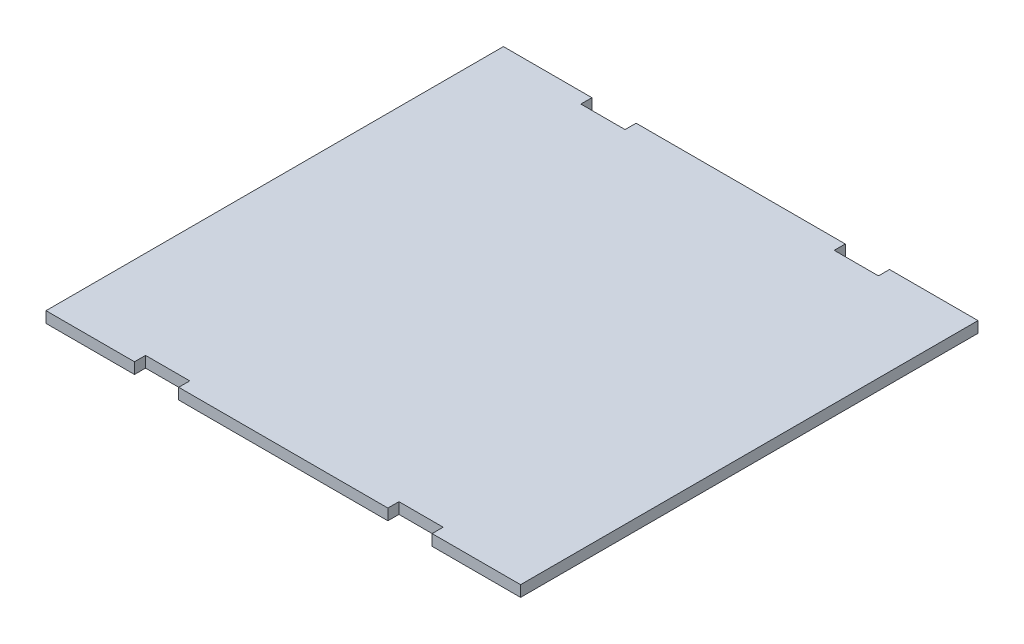
ISO-10303-21;
HEADER;
FILE_DESCRIPTION(('STEP AP214'),'2;1');
FILE_NAME('part.step','',(''),(''),'','','');
FILE_SCHEMA(('AUTOMOTIVE_DESIGN { 1 0 10303 214 1 1 1 1 }'));
ENDSEC;
DATA;
#1=APPLICATION_CONTEXT('core data for automotive mechanical design processes');
#2=APPLICATION_PROTOCOL_DEFINITION('international standard','automotive_design',2000,#1);
#3=PRODUCT_CONTEXT('',#1,'mechanical');
#4=PRODUCT('Part','Part','',(#3));
#5=PRODUCT_RELATED_PRODUCT_CATEGORY('part','',(#4));
#6=PRODUCT_DEFINITION_FORMATION('','',#4);
#7=PRODUCT_DEFINITION_CONTEXT('part definition',#1,'design');
#8=PRODUCT_DEFINITION('design','',#6,#7);
#9=PRODUCT_DEFINITION_SHAPE('','',#8);
#10=(LENGTH_UNIT() NAMED_UNIT(*) SI_UNIT(.MILLI.,.METRE.));
#11=(NAMED_UNIT(*) PLANE_ANGLE_UNIT() SI_UNIT($,.RADIAN.));
#12=(NAMED_UNIT(*) SI_UNIT($,.STERADIAN.) SOLID_ANGLE_UNIT());
#13=UNCERTAINTY_MEASURE_WITH_UNIT(LENGTH_MEASURE(1.E-05),#10,'distance_accuracy_value','');
#14=(GEOMETRIC_REPRESENTATION_CONTEXT(3) GLOBAL_UNCERTAINTY_ASSIGNED_CONTEXT((#13)) GLOBAL_UNIT_ASSIGNED_CONTEXT((#10,
#11,#12)) REPRESENTATION_CONTEXT('',''));
#15=CARTESIAN_POINT('',(0.,0.,0.));
#16=DIRECTION('',(0.,0.,1.));
#17=DIRECTION('',(1.,0.,0.));
#18=AXIS2_PLACEMENT_3D('',#15,#16,#17);
#19=CARTESIAN_POINT('',(-68.1228,3.175,-65.659));
#20=DIRECTION('',(1.,0.,0.));
#21=DIRECTION('',(0.,0.,-1.));
#22=AXIS2_PLACEMENT_3D('',#19,#20,#21);
#23=PLANE('',#22);
#24=DIRECTION('',(0.,0.,1.));
#25=VECTOR('',#24,1.);
#26=CARTESIAN_POINT('',(-68.1228,0.,-65.659));
#27=LINE('',#26,#25);
#28=CARTESIAN_POINT('',(-68.1228,0.,-65.659));
#29=VERTEX_POINT('',#28);
#30=CARTESIAN_POINT('',(-68.1228,0.,65.659));
#31=VERTEX_POINT('',#30);
#32=EDGE_CURVE('E201',#29,#31,#27,.T.);
#33=ORIENTED_EDGE('',*,*,#32,.T.);
#34=DIRECTION('',(0.,-1.,0.));
#35=VECTOR('',#34,1.);
#36=CARTESIAN_POINT('',(-68.1228,3.175,65.659));
#37=LINE('',#36,#35);
#38=CARTESIAN_POINT('',(-68.1228,3.175,65.659));
#39=VERTEX_POINT('',#38);
#40=EDGE_CURVE('E11',#39,#31,#37,.T.);
#41=ORIENTED_EDGE('',*,*,#40,.F.);
#42=DIRECTION('',(0.,0.,1.));
#43=VECTOR('',#42,1.);
#44=CARTESIAN_POINT('',(-68.1228,3.175,-65.659));
#45=LINE('',#44,#43);
#46=CARTESIAN_POINT('',(-68.1228,3.175,-65.659));
#47=VERTEX_POINT('',#46);
#48=EDGE_CURVE('E239',#47,#39,#45,.T.);
#49=ORIENTED_EDGE('',*,*,#48,.F.);
#50=DIRECTION('',(0.,-1.,0.));
#51=VECTOR('',#50,1.);
#52=CARTESIAN_POINT('',(-68.1228,3.175,-65.659));
#53=LINE('',#52,#51);
#54=EDGE_CURVE('E197',#47,#29,#53,.T.);
#55=ORIENTED_EDGE('',*,*,#54,.T.);
#56=EDGE_LOOP('',(#33,#41,#49,#55));
#57=FACE_BOUND('',#56,.T.);
#58=ADVANCED_FACE('F33',(#57),#23,.F.);
#59=CARTESIAN_POINT('',(-68.1228,3.175,65.659));
#60=DIRECTION('',(0.,0.,-1.));
#61=DIRECTION('',(-1.,0.,0.));
#62=AXIS2_PLACEMENT_3D('',#59,#60,#61);
#63=PLANE('',#62);
#64=DIRECTION('',(1.,0.,0.));
#65=VECTOR('',#64,1.);
#66=CARTESIAN_POINT('',(-68.1228,0.,65.659));
#67=LINE('',#66,#65);
#68=CARTESIAN_POINT('',(-42.7228,0.,65.659));
#69=VERTEX_POINT('',#68);
#70=EDGE_CURVE('E204',#31,#69,#67,.T.);
#71=ORIENTED_EDGE('',*,*,#70,.T.);
#72=DIRECTION('',(0.,-1.,0.));
#73=VECTOR('',#72,1.);
#74=CARTESIAN_POINT('',(-42.7228,3.175,65.659));
#75=LINE('',#74,#73);
#76=CARTESIAN_POINT('',(-42.7228,3.175,65.659));
#77=VERTEX_POINT('',#76);
#78=EDGE_CURVE('E41',#77,#69,#75,.T.);
#79=ORIENTED_EDGE('',*,*,#78,.F.);
#80=DIRECTION('',(1.,0.,0.));
#81=VECTOR('',#80,1.);
#82=CARTESIAN_POINT('',(-68.1228,3.175,65.659));
#83=LINE('',#82,#81);
#84=EDGE_CURVE('E128',#39,#77,#83,.T.);
#85=ORIENTED_EDGE('',*,*,#84,.F.);
#86=ORIENTED_EDGE('',*,*,#40,.T.);
#87=EDGE_LOOP('',(#71,#79,#85,#86));
#88=FACE_BOUND('',#87,.T.);
#89=ADVANCED_FACE('F357',(#88),#63,.F.);
#90=CARTESIAN_POINT('',(-42.7228,3.175,65.659));
#91=DIRECTION('',(-1.,0.,0.));
#92=DIRECTION('',(0.,0.,1.));
#93=AXIS2_PLACEMENT_3D('',#90,#91,#92);
#94=PLANE('',#93);
#95=DIRECTION('',(0.,0.,-1.));
#96=VECTOR('',#95,1.);
#97=CARTESIAN_POINT('',(-42.7228,0.,65.659));
#98=LINE('',#97,#96);
#99=CARTESIAN_POINT('',(-42.7228,0.,62.484));
#100=VERTEX_POINT('',#99);
#101=EDGE_CURVE('E206',#69,#100,#98,.T.);
#102=ORIENTED_EDGE('',*,*,#101,.T.);
#103=DIRECTION('',(0.,-1.,0.));
#104=VECTOR('',#103,1.);
#105=CARTESIAN_POINT('',(-42.7228,3.175,62.484));
#106=LINE('',#105,#104);
#107=CARTESIAN_POINT('',(-42.7228,3.175,62.484));
#108=VERTEX_POINT('',#107);
#109=EDGE_CURVE('E282',#108,#100,#106,.T.);
#110=ORIENTED_EDGE('',*,*,#109,.F.);
#111=DIRECTION('',(0.,0.,-1.));
#112=VECTOR('',#111,1.);
#113=CARTESIAN_POINT('',(-42.7228,3.175,65.659));
#114=LINE('',#113,#112);
#115=EDGE_CURVE('E290',#77,#108,#114,.T.);
#116=ORIENTED_EDGE('',*,*,#115,.F.);
#117=ORIENTED_EDGE('',*,*,#78,.T.);
#118=EDGE_LOOP('',(#102,#110,#116,#117));
#119=FACE_BOUND('',#118,.T.);
#120=ADVANCED_FACE('F288',(#119),#94,.F.);
#121=CARTESIAN_POINT('',(-42.7228,3.175,62.484));
#122=DIRECTION('',(0.,0.,-1.));
#123=DIRECTION('',(-1.,0.,0.));
#124=AXIS2_PLACEMENT_3D('',#121,#122,#123);
#125=PLANE('',#124);
#126=DIRECTION('',(1.,0.,0.));
#127=VECTOR('',#126,1.);
#128=CARTESIAN_POINT('',(-42.7228,0.,62.484));
#129=LINE('',#128,#127);
#130=CARTESIAN_POINT('',(-30.0228,0.,62.484));
#131=VERTEX_POINT('',#130);
#132=EDGE_CURVE('E208',#100,#131,#129,.T.);
#133=ORIENTED_EDGE('',*,*,#132,.T.);
#134=DIRECTION('',(0.,-1.,0.));
#135=VECTOR('',#134,1.);
#136=CARTESIAN_POINT('',(-30.0228,3.175,62.484));
#137=LINE('',#136,#135);
#138=CARTESIAN_POINT('',(-30.0228,3.175,62.484));
#139=VERTEX_POINT('',#138);
#140=EDGE_CURVE('E279',#139,#131,#137,.T.);
#141=ORIENTED_EDGE('',*,*,#140,.F.);
#142=DIRECTION('',(1.,0.,0.));
#143=VECTOR('',#142,1.);
#144=CARTESIAN_POINT('',(-42.7228,3.175,62.484));
#145=LINE('',#144,#143);
#146=EDGE_CURVE('E308',#108,#139,#145,.T.);
#147=ORIENTED_EDGE('',*,*,#146,.F.);
#148=ORIENTED_EDGE('',*,*,#109,.T.);
#149=EDGE_LOOP('',(#133,#141,#147,#148));
#150=FACE_BOUND('',#149,.T.);
#151=ADVANCED_FACE('F299',(#150),#125,.F.);
#152=CARTESIAN_POINT('',(-30.0228,3.175,62.484));
#153=DIRECTION('',(1.,0.,0.));
#154=DIRECTION('',(0.,0.,-1.));
#155=AXIS2_PLACEMENT_3D('',#152,#153,#154);
#156=PLANE('',#155);
#157=DIRECTION('',(0.,0.,1.));
#158=VECTOR('',#157,1.);
#159=CARTESIAN_POINT('',(-30.0228,0.,62.484));
#160=LINE('',#159,#158);
#161=CARTESIAN_POINT('',(-30.0228,0.,65.659));
#162=VERTEX_POINT('',#161);
#163=EDGE_CURVE('E210',#131,#162,#160,.T.);
#164=ORIENTED_EDGE('',*,*,#163,.T.);
#165=DIRECTION('',(0.,-1.,0.));
#166=VECTOR('',#165,1.);
#167=CARTESIAN_POINT('',(-30.0228,3.175,65.659));
#168=LINE('',#167,#166);
#169=CARTESIAN_POINT('',(-30.0228,3.175,65.659));
#170=VERTEX_POINT('',#169);
#171=EDGE_CURVE('E276',#170,#162,#168,.T.);
#172=ORIENTED_EDGE('',*,*,#171,.F.);
#173=DIRECTION('',(0.,0.,1.));
#174=VECTOR('',#173,1.);
#175=CARTESIAN_POINT('',(-30.0228,3.175,62.484));
#176=LINE('',#175,#174);
#177=EDGE_CURVE('E305',#139,#170,#176,.T.);
#178=ORIENTED_EDGE('',*,*,#177,.F.);
#179=ORIENTED_EDGE('',*,*,#140,.T.);
#180=EDGE_LOOP('',(#164,#172,#178,#179));
#181=FACE_BOUND('',#180,.T.);
#182=ADVANCED_FACE('F303',(#181),#156,.F.);
#183=CARTESIAN_POINT('',(-30.0228,3.175,65.659));
#184=DIRECTION('',(0.,0.,-1.));
#185=DIRECTION('',(-1.,0.,0.));
#186=AXIS2_PLACEMENT_3D('',#183,#184,#185);
#187=PLANE('',#186);
#188=DIRECTION('',(1.,0.,0.));
#189=VECTOR('',#188,1.);
#190=CARTESIAN_POINT('',(-30.0228,0.,65.659));
#191=LINE('',#190,#189);
#192=CARTESIAN_POINT('',(30.0228000000001,0.,65.659));
#193=VERTEX_POINT('',#192);
#194=EDGE_CURVE('E212',#162,#193,#191,.T.);
#195=ORIENTED_EDGE('',*,*,#194,.T.);
#196=DIRECTION('',(0.,-1.,0.));
#197=VECTOR('',#196,1.);
#198=CARTESIAN_POINT('',(30.0228000000001,3.175,65.659));
#199=LINE('',#198,#197);
#200=CARTESIAN_POINT('',(30.0228000000001,3.175,65.659));
#201=VERTEX_POINT('',#200);
#202=EDGE_CURVE('E273',#201,#193,#199,.T.);
#203=ORIENTED_EDGE('',*,*,#202,.F.);
#204=DIRECTION('',(1.,0.,0.));
#205=VECTOR('',#204,1.);
#206=CARTESIAN_POINT('',(-30.0228,3.175,65.659));
#207=LINE('',#206,#205);
#208=EDGE_CURVE('E307',#170,#201,#207,.T.);
#209=ORIENTED_EDGE('',*,*,#208,.F.);
#210=ORIENTED_EDGE('',*,*,#171,.T.);
#211=EDGE_LOOP('',(#195,#203,#209,#210));
#212=FACE_BOUND('',#211,.T.);
#213=ADVANCED_FACE('F370',(#212),#187,.F.);
#214=CARTESIAN_POINT('',(30.0228000000001,3.175,65.659));
#215=DIRECTION('',(-1.,0.,0.));
#216=DIRECTION('',(0.,0.,1.));
#217=AXIS2_PLACEMENT_3D('',#214,#215,#216);
#218=PLANE('',#217);
#219=DIRECTION('',(0.,0.,-1.));
#220=VECTOR('',#219,1.);
#221=CARTESIAN_POINT('',(30.0228000000001,0.,65.659));
#222=LINE('',#221,#220);
#223=CARTESIAN_POINT('',(30.0228000000001,0.,62.484));
#224=VERTEX_POINT('',#223);
#225=EDGE_CURVE('E214',#193,#224,#222,.T.);
#226=ORIENTED_EDGE('',*,*,#225,.T.);
#227=DIRECTION('',(0.,-1.,0.));
#228=VECTOR('',#227,1.);
#229=CARTESIAN_POINT('',(30.0228000000001,3.175,62.484));
#230=LINE('',#229,#228);
#231=CARTESIAN_POINT('',(30.0228000000001,3.175,62.484));
#232=VERTEX_POINT('',#231);
#233=EDGE_CURVE('E270',#232,#224,#230,.T.);
#234=ORIENTED_EDGE('',*,*,#233,.F.);
#235=DIRECTION('',(0.,0.,-1.));
#236=VECTOR('',#235,1.);
#237=CARTESIAN_POINT('',(30.0228000000001,3.175,65.659));
#238=LINE('',#237,#236);
#239=EDGE_CURVE('E310',#201,#232,#238,.T.);
#240=ORIENTED_EDGE('',*,*,#239,.F.);
#241=ORIENTED_EDGE('',*,*,#202,.T.);
#242=EDGE_LOOP('',(#226,#234,#240,#241));
#243=FACE_BOUND('',#242,.T.);
#244=ADVANCED_FACE('F373',(#243),#218,.F.);
#245=CARTESIAN_POINT('',(30.0228000000001,3.175,62.484));
#246=DIRECTION('',(0.,0.,-1.));
#247=DIRECTION('',(-1.,0.,0.));
#248=AXIS2_PLACEMENT_3D('',#245,#246,#247);
#249=PLANE('',#248);
#250=DIRECTION('',(1.,0.,0.));
#251=VECTOR('',#250,1.);
#252=CARTESIAN_POINT('',(30.0228000000001,0.,62.484));
#253=LINE('',#252,#251);
#254=CARTESIAN_POINT('',(42.7228000000001,0.,62.484));
#255=VERTEX_POINT('',#254);
#256=EDGE_CURVE('E216',#224,#255,#253,.T.);
#257=ORIENTED_EDGE('',*,*,#256,.T.);
#258=DIRECTION('',(0.,-1.,0.));
#259=VECTOR('',#258,1.);
#260=CARTESIAN_POINT('',(42.7228000000001,3.175,62.484));
#261=LINE('',#260,#259);
#262=CARTESIAN_POINT('',(42.7228000000001,3.175,62.484));
#263=VERTEX_POINT('',#262);
#264=EDGE_CURVE('E267',#263,#255,#261,.T.);
#265=ORIENTED_EDGE('',*,*,#264,.F.);
#266=DIRECTION('',(1.,0.,0.));
#267=VECTOR('',#266,1.);
#268=CARTESIAN_POINT('',(30.0228000000001,3.175,62.484));
#269=LINE('',#268,#267);
#270=EDGE_CURVE('E316',#232,#263,#269,.T.);
#271=ORIENTED_EDGE('',*,*,#270,.F.);
#272=ORIENTED_EDGE('',*,*,#233,.T.);
#273=EDGE_LOOP('',(#257,#265,#271,#272));
#274=FACE_BOUND('',#273,.T.);
#275=ADVANCED_FACE('F377',(#274),#249,.F.);
#276=CARTESIAN_POINT('',(42.7228000000001,3.175,62.484));
#277=DIRECTION('',(1.,0.,0.));
#278=DIRECTION('',(0.,0.,-1.));
#279=AXIS2_PLACEMENT_3D('',#276,#277,#278);
#280=PLANE('',#279);
#281=DIRECTION('',(0.,0.,1.));
#282=VECTOR('',#281,1.);
#283=CARTESIAN_POINT('',(42.7228000000001,0.,62.484));
#284=LINE('',#283,#282);
#285=CARTESIAN_POINT('',(42.7228000000001,0.,65.659));
#286=VERTEX_POINT('',#285);
#287=EDGE_CURVE('E218',#255,#286,#284,.T.);
#288=ORIENTED_EDGE('',*,*,#287,.T.);
#289=DIRECTION('',(0.,-1.,0.));
#290=VECTOR('',#289,1.);
#291=CARTESIAN_POINT('',(42.7228000000001,3.175,65.659));
#292=LINE('',#291,#290);
#293=CARTESIAN_POINT('',(42.7228000000001,3.175,65.659));
#294=VERTEX_POINT('',#293);
#295=EDGE_CURVE('E264',#294,#286,#292,.T.);
#296=ORIENTED_EDGE('',*,*,#295,.F.);
#297=DIRECTION('',(0.,0.,1.));
#298=VECTOR('',#297,1.);
#299=CARTESIAN_POINT('',(42.7228000000001,3.175,62.484));
#300=LINE('',#299,#298);
#301=EDGE_CURVE('E318',#263,#294,#300,.T.);
#302=ORIENTED_EDGE('',*,*,#301,.F.);
#303=ORIENTED_EDGE('',*,*,#264,.T.);
#304=EDGE_LOOP('',(#288,#296,#302,#303));
#305=FACE_BOUND('',#304,.T.);
#306=ADVANCED_FACE('F381',(#305),#280,.F.);
#307=CARTESIAN_POINT('',(42.7228000000001,3.175,65.659));
#308=DIRECTION('',(0.,0.,-1.));
#309=DIRECTION('',(-1.,0.,0.));
#310=AXIS2_PLACEMENT_3D('',#307,#308,#309);
#311=PLANE('',#310);
#312=DIRECTION('',(1.,0.,0.));
#313=VECTOR('',#312,1.);
#314=CARTESIAN_POINT('',(42.7228000000001,0.,65.659));
#315=LINE('',#314,#313);
#316=CARTESIAN_POINT('',(68.1228,0.,65.659));
#317=VERTEX_POINT('',#316);
#318=EDGE_CURVE('E220',#286,#317,#315,.T.);
#319=ORIENTED_EDGE('',*,*,#318,.T.);
#320=DIRECTION('',(0.,-1.,0.));
#321=VECTOR('',#320,1.);
#322=CARTESIAN_POINT('',(68.1228,3.175,65.659));
#323=LINE('',#322,#321);
#324=CARTESIAN_POINT('',(68.1228,3.175,65.659));
#325=VERTEX_POINT('',#324);
#326=EDGE_CURVE('E261',#325,#317,#323,.T.);
#327=ORIENTED_EDGE('',*,*,#326,.F.);
#328=DIRECTION('',(1.,0.,0.));
#329=VECTOR('',#328,1.);
#330=CARTESIAN_POINT('',(42.7228000000001,3.175,65.659));
#331=LINE('',#330,#329);
#332=EDGE_CURVE('E320',#294,#325,#331,.T.);
#333=ORIENTED_EDGE('',*,*,#332,.F.);
#334=ORIENTED_EDGE('',*,*,#295,.T.);
#335=EDGE_LOOP('',(#319,#327,#333,#334));
#336=FACE_BOUND('',#335,.T.);
#337=ADVANCED_FACE('F385',(#336),#311,.F.);
#338=CARTESIAN_POINT('',(68.1228,3.175,-65.659));
#339=DIRECTION('',(-1.,0.,0.));
#340=DIRECTION('',(0.,0.,1.));
#341=AXIS2_PLACEMENT_3D('',#338,#339,#340);
#342=PLANE('',#341);
#343=DIRECTION('',(0.,0.,-1.));
#344=VECTOR('',#343,1.);
#345=CARTESIAN_POINT('',(68.1228,0.,-65.659));
#346=LINE('',#345,#344);
#347=CARTESIAN_POINT('',(68.1228,0.,-65.659));
#348=VERTEX_POINT('',#347);
#349=EDGE_CURVE('E222',#317,#348,#346,.T.);
#350=ORIENTED_EDGE('',*,*,#349,.T.);
#351=DIRECTION('',(0.,-1.,0.));
#352=VECTOR('',#351,1.);
#353=CARTESIAN_POINT('',(68.1228,3.175,-65.659));
#354=LINE('',#353,#352);
#355=CARTESIAN_POINT('',(68.1228,3.175,-65.659));
#356=VERTEX_POINT('',#355);
#357=EDGE_CURVE('E258',#356,#348,#354,.T.);
#358=ORIENTED_EDGE('',*,*,#357,.F.);
#359=DIRECTION('',(0.,0.,-1.));
#360=VECTOR('',#359,1.);
#361=CARTESIAN_POINT('',(68.1228,3.175,-65.659));
#362=LINE('',#361,#360);
#363=EDGE_CURVE('E322',#325,#356,#362,.T.);
#364=ORIENTED_EDGE('',*,*,#363,.F.);
#365=ORIENTED_EDGE('',*,*,#326,.T.);
#366=EDGE_LOOP('',(#350,#358,#364,#365));
#367=FACE_BOUND('',#366,.T.);
#368=ADVANCED_FACE('F389',(#367),#342,.F.);
#369=CARTESIAN_POINT('',(42.7228,3.175,-65.659));
#370=DIRECTION('',(0.,0.,1.));
#371=DIRECTION('',(1.,0.,0.));
#372=AXIS2_PLACEMENT_3D('',#369,#370,#371);
#373=PLANE('',#372);
#374=DIRECTION('',(-1.,0.,0.));
#375=VECTOR('',#374,1.);
#376=CARTESIAN_POINT('',(42.7228,0.,-65.659));
#377=LINE('',#376,#375);
#378=CARTESIAN_POINT('',(42.7228,0.,-65.659));
#379=VERTEX_POINT('',#378);
#380=EDGE_CURVE('E224',#348,#379,#377,.T.);
#381=ORIENTED_EDGE('',*,*,#380,.T.);
#382=DIRECTION('',(0.,-1.,0.));
#383=VECTOR('',#382,1.);
#384=CARTESIAN_POINT('',(42.7228,3.175,-65.659));
#385=LINE('',#384,#383);
#386=CARTESIAN_POINT('',(42.7228,3.175,-65.659));
#387=VERTEX_POINT('',#386);
#388=EDGE_CURVE('E255',#387,#379,#385,.T.);
#389=ORIENTED_EDGE('',*,*,#388,.F.);
#390=DIRECTION('',(-1.,0.,0.));
#391=VECTOR('',#390,1.);
#392=CARTESIAN_POINT('',(42.7228,3.175,-65.659));
#393=LINE('',#392,#391);
#394=EDGE_CURVE('E324',#356,#387,#393,.T.);
#395=ORIENTED_EDGE('',*,*,#394,.F.);
#396=ORIENTED_EDGE('',*,*,#357,.T.);
#397=EDGE_LOOP('',(#381,#389,#395,#396));
#398=FACE_BOUND('',#397,.T.);
#399=ADVANCED_FACE('F393',(#398),#373,.F.);
#400=CARTESIAN_POINT('',(42.7228,3.175,-62.484));
#401=DIRECTION('',(1.,0.,0.));
#402=DIRECTION('',(0.,0.,-1.));
#403=AXIS2_PLACEMENT_3D('',#400,#401,#402);
#404=PLANE('',#403);
#405=DIRECTION('',(0.,0.,1.));
#406=VECTOR('',#405,1.);
#407=CARTESIAN_POINT('',(42.7228,0.,-62.484));
#408=LINE('',#407,#406);
#409=CARTESIAN_POINT('',(42.7228,0.,-62.484));
#410=VERTEX_POINT('',#409);
#411=EDGE_CURVE('E226',#379,#410,#408,.T.);
#412=ORIENTED_EDGE('',*,*,#411,.T.);
#413=DIRECTION('',(0.,-1.,0.));
#414=VECTOR('',#413,1.);
#415=CARTESIAN_POINT('',(42.7228,3.175,-62.484));
#416=LINE('',#415,#414);
#417=CARTESIAN_POINT('',(42.7228,3.175,-62.484));
#418=VERTEX_POINT('',#417);
#419=EDGE_CURVE('E252',#418,#410,#416,.T.);
#420=ORIENTED_EDGE('',*,*,#419,.F.);
#421=DIRECTION('',(0.,0.,1.));
#422=VECTOR('',#421,1.);
#423=CARTESIAN_POINT('',(42.7228,3.175,-62.484));
#424=LINE('',#423,#422);
#425=EDGE_CURVE('E326',#387,#418,#424,.T.);
#426=ORIENTED_EDGE('',*,*,#425,.F.);
#427=ORIENTED_EDGE('',*,*,#388,.T.);
#428=EDGE_LOOP('',(#412,#420,#426,#427));
#429=FACE_BOUND('',#428,.T.);
#430=ADVANCED_FACE('F397',(#429),#404,.F.);
#431=CARTESIAN_POINT('',(30.0228,3.175,-62.484));
#432=DIRECTION('',(0.,0.,1.));
#433=DIRECTION('',(1.,0.,0.));
#434=AXIS2_PLACEMENT_3D('',#431,#432,#433);
#435=PLANE('',#434);
#436=DIRECTION('',(-1.,0.,0.));
#437=VECTOR('',#436,1.);
#438=CARTESIAN_POINT('',(30.0228,0.,-62.484));
#439=LINE('',#438,#437);
#440=CARTESIAN_POINT('',(30.0228,0.,-62.484));
#441=VERTEX_POINT('',#440);
#442=EDGE_CURVE('E228',#410,#441,#439,.T.);
#443=ORIENTED_EDGE('',*,*,#442,.T.);
#444=DIRECTION('',(0.,-1.,0.));
#445=VECTOR('',#444,1.);
#446=CARTESIAN_POINT('',(30.0228,3.175,-62.484));
#447=LINE('',#446,#445);
#448=CARTESIAN_POINT('',(30.0228,3.175,-62.484));
#449=VERTEX_POINT('',#448);
#450=EDGE_CURVE('E249',#449,#441,#447,.T.);
#451=ORIENTED_EDGE('',*,*,#450,.F.);
#452=DIRECTION('',(-1.,0.,0.));
#453=VECTOR('',#452,1.);
#454=CARTESIAN_POINT('',(30.0228,3.175,-62.484));
#455=LINE('',#454,#453);
#456=EDGE_CURVE('E328',#418,#449,#455,.T.);
#457=ORIENTED_EDGE('',*,*,#456,.F.);
#458=ORIENTED_EDGE('',*,*,#419,.T.);
#459=EDGE_LOOP('',(#443,#451,#457,#458));
#460=FACE_BOUND('',#459,.T.);
#461=ADVANCED_FACE('F401',(#460),#435,.F.);
#462=CARTESIAN_POINT('',(30.0228,3.175,-65.659));
#463=DIRECTION('',(-1.,0.,0.));
#464=DIRECTION('',(0.,0.,1.));
#465=AXIS2_PLACEMENT_3D('',#462,#463,#464);
#466=PLANE('',#465);
#467=DIRECTION('',(0.,0.,-1.));
#468=VECTOR('',#467,1.);
#469=CARTESIAN_POINT('',(30.0228,0.,-65.659));
#470=LINE('',#469,#468);
#471=CARTESIAN_POINT('',(30.0228,0.,-65.659));
#472=VERTEX_POINT('',#471);
#473=EDGE_CURVE('E230',#441,#472,#470,.T.);
#474=ORIENTED_EDGE('',*,*,#473,.T.);
#475=DIRECTION('',(0.,-1.,0.));
#476=VECTOR('',#475,1.);
#477=CARTESIAN_POINT('',(30.0228,3.175,-65.659));
#478=LINE('',#477,#476);
#479=CARTESIAN_POINT('',(30.0228,3.175,-65.659));
#480=VERTEX_POINT('',#479);
#481=EDGE_CURVE('E246',#480,#472,#478,.T.);
#482=ORIENTED_EDGE('',*,*,#481,.F.);
#483=DIRECTION('',(0.,0.,-1.));
#484=VECTOR('',#483,1.);
#485=CARTESIAN_POINT('',(30.0228,3.175,-65.659));
#486=LINE('',#485,#484);
#487=EDGE_CURVE('E330',#449,#480,#486,.T.);
#488=ORIENTED_EDGE('',*,*,#487,.F.);
#489=ORIENTED_EDGE('',*,*,#450,.T.);
#490=EDGE_LOOP('',(#474,#482,#488,#489));
#491=FACE_BOUND('',#490,.T.);
#492=ADVANCED_FACE('F405',(#491),#466,.F.);
#493=CARTESIAN_POINT('',(-30.0228,3.175,-65.659));
#494=DIRECTION('',(0.,0.,1.));
#495=DIRECTION('',(1.,0.,0.));
#496=AXIS2_PLACEMENT_3D('',#493,#494,#495);
#497=PLANE('',#496);
#498=DIRECTION('',(-1.,0.,0.));
#499=VECTOR('',#498,1.);
#500=CARTESIAN_POINT('',(-30.0228,0.,-65.659));
#501=LINE('',#500,#499);
#502=CARTESIAN_POINT('',(-30.0228,0.,-65.659));
#503=VERTEX_POINT('',#502);
#504=EDGE_CURVE('E232',#472,#503,#501,.T.);
#505=ORIENTED_EDGE('',*,*,#504,.T.);
#506=DIRECTION('',(0.,-1.,0.));
#507=VECTOR('',#506,1.);
#508=CARTESIAN_POINT('',(-30.0228,3.175,-65.659));
#509=LINE('',#508,#507);
#510=CARTESIAN_POINT('',(-30.0228,3.175,-65.659));
#511=VERTEX_POINT('',#510);
#512=EDGE_CURVE('E243',#511,#503,#509,.T.);
#513=ORIENTED_EDGE('',*,*,#512,.F.);
#514=DIRECTION('',(-1.,0.,0.));
#515=VECTOR('',#514,1.);
#516=CARTESIAN_POINT('',(-30.0228,3.175,-65.659));
#517=LINE('',#516,#515);
#518=EDGE_CURVE('E332',#480,#511,#517,.T.);
#519=ORIENTED_EDGE('',*,*,#518,.F.);
#520=ORIENTED_EDGE('',*,*,#481,.T.);
#521=EDGE_LOOP('',(#505,#513,#519,#520));
#522=FACE_BOUND('',#521,.T.);
#523=ADVANCED_FACE('F338',(#522),#497,.F.);
#524=CARTESIAN_POINT('',(-30.0228,3.175,-62.484));
#525=DIRECTION('',(1.,0.,0.));
#526=DIRECTION('',(0.,0.,-1.));
#527=AXIS2_PLACEMENT_3D('',#524,#525,#526);
#528=PLANE('',#527);
#529=DIRECTION('',(0.,0.,1.));
#530=VECTOR('',#529,1.);
#531=CARTESIAN_POINT('',(-30.0228,0.,-62.484));
#532=LINE('',#531,#530);
#533=CARTESIAN_POINT('',(-30.0228,0.,-62.484));
#534=VERTEX_POINT('',#533);
#535=EDGE_CURVE('E234',#503,#534,#532,.T.);
#536=ORIENTED_EDGE('',*,*,#535,.T.);
#537=DIRECTION('',(0.,-1.,0.));
#538=VECTOR('',#537,1.);
#539=CARTESIAN_POINT('',(-30.0228,3.175,-62.484));
#540=LINE('',#539,#538);
#541=CARTESIAN_POINT('',(-30.0228,3.175,-62.484));
#542=VERTEX_POINT('',#541);
#543=EDGE_CURVE('E192',#542,#534,#540,.T.);
#544=ORIENTED_EDGE('',*,*,#543,.F.);
#545=DIRECTION('',(0.,0.,1.));
#546=VECTOR('',#545,1.);
#547=CARTESIAN_POINT('',(-30.0228,3.175,-62.484));
#548=LINE('',#547,#546);
#549=EDGE_CURVE('E183',#511,#542,#548,.T.);
#550=ORIENTED_EDGE('',*,*,#549,.F.);
#551=ORIENTED_EDGE('',*,*,#512,.T.);
#552=EDGE_LOOP('',(#536,#544,#550,#551));
#553=FACE_BOUND('',#552,.T.);
#554=ADVANCED_FACE('F342',(#553),#528,.F.);
#555=CARTESIAN_POINT('',(-42.7228,3.175,-62.484));
#556=DIRECTION('',(0.,0.,1.));
#557=DIRECTION('',(1.,0.,0.));
#558=AXIS2_PLACEMENT_3D('',#555,#556,#557);
#559=PLANE('',#558);
#560=DIRECTION('',(-1.,0.,0.));
#561=VECTOR('',#560,1.);
#562=CARTESIAN_POINT('',(-42.7228,0.,-62.484));
#563=LINE('',#562,#561);
#564=CARTESIAN_POINT('',(-42.7228,0.,-62.484));
#565=VERTEX_POINT('',#564);
#566=EDGE_CURVE('E191',#534,#565,#563,.T.);
#567=ORIENTED_EDGE('',*,*,#566,.T.);
#568=DIRECTION('',(0.,-1.,0.));
#569=VECTOR('',#568,1.);
#570=CARTESIAN_POINT('',(-42.7228,3.175,-62.484));
#571=LINE('',#570,#569);
#572=CARTESIAN_POINT('',(-42.7228,3.175,-62.484));
#573=VERTEX_POINT('',#572);
#574=EDGE_CURVE('E188',#573,#565,#571,.T.);
#575=ORIENTED_EDGE('',*,*,#574,.F.);
#576=DIRECTION('',(-1.,0.,0.));
#577=VECTOR('',#576,1.);
#578=CARTESIAN_POINT('',(-42.7228,3.175,-62.484));
#579=LINE('',#578,#577);
#580=EDGE_CURVE('E177',#542,#573,#579,.T.);
#581=ORIENTED_EDGE('',*,*,#580,.F.);
#582=ORIENTED_EDGE('',*,*,#543,.T.);
#583=EDGE_LOOP('',(#567,#575,#581,#582));
#584=FACE_BOUND('',#583,.T.);
#585=ADVANCED_FACE('F189',(#584),#559,.F.);
#586=CARTESIAN_POINT('',(-42.7228,3.175,-65.659));
#587=DIRECTION('',(-1.,0.,0.));
#588=DIRECTION('',(0.,0.,1.));
#589=AXIS2_PLACEMENT_3D('',#586,#587,#588);
#590=PLANE('',#589);
#591=DIRECTION('',(0.,0.,-1.));
#592=VECTOR('',#591,1.);
#593=CARTESIAN_POINT('',(-42.7228,0.,-65.659));
#594=LINE('',#593,#592);
#595=CARTESIAN_POINT('',(-42.7228,0.,-65.659));
#596=VERTEX_POINT('',#595);
#597=EDGE_CURVE('E114',#565,#596,#594,.T.);
#598=ORIENTED_EDGE('',*,*,#597,.T.);
#599=DIRECTION('',(0.,-1.,0.));
#600=VECTOR('',#599,1.);
#601=CARTESIAN_POINT('',(-42.7228,3.175,-65.659));
#602=LINE('',#601,#600);
#603=CARTESIAN_POINT('',(-42.7228,3.175,-65.659));
#604=VERTEX_POINT('',#603);
#605=EDGE_CURVE('E193',#604,#596,#602,.T.);
#606=ORIENTED_EDGE('',*,*,#605,.F.);
#607=DIRECTION('',(0.,0.,-1.));
#608=VECTOR('',#607,1.);
#609=CARTESIAN_POINT('',(-42.7228,3.175,-65.659));
#610=LINE('',#609,#608);
#611=EDGE_CURVE('E181',#573,#604,#610,.T.);
#612=ORIENTED_EDGE('',*,*,#611,.F.);
#613=ORIENTED_EDGE('',*,*,#574,.T.);
#614=EDGE_LOOP('',(#598,#606,#612,#613));
#615=FACE_BOUND('',#614,.T.);
#616=ADVANCED_FACE('F195',(#615),#590,.F.);
#617=CARTESIAN_POINT('',(-68.1228,3.175,-65.659));
#618=DIRECTION('',(0.,0.,1.));
#619=DIRECTION('',(1.,0.,0.));
#620=AXIS2_PLACEMENT_3D('',#617,#618,#619);
#621=PLANE('',#620);
#622=DIRECTION('',(-1.,0.,0.));
#623=VECTOR('',#622,1.);
#624=CARTESIAN_POINT('',(-68.1228,0.,-65.659));
#625=LINE('',#624,#623);
#626=EDGE_CURVE('E120',#596,#29,#625,.T.);
#627=ORIENTED_EDGE('',*,*,#626,.T.);
#628=ORIENTED_EDGE('',*,*,#54,.F.);
#629=DIRECTION('',(-1.,0.,0.));
#630=VECTOR('',#629,1.);
#631=CARTESIAN_POINT('',(-68.1228,3.175,-65.659));
#632=LINE('',#631,#630);
#633=EDGE_CURVE('E49',#604,#47,#632,.T.);
#634=ORIENTED_EDGE('',*,*,#633,.F.);
#635=ORIENTED_EDGE('',*,*,#605,.T.);
#636=EDGE_LOOP('',(#627,#628,#634,#635));
#637=FACE_BOUND('',#636,.T.);
#638=ADVANCED_FACE('F346',(#637),#621,.F.);
#639=CARTESIAN_POINT('',(0.,3.175,0.));
#640=DIRECTION('',(0.,1.,0.));
#641=DIRECTION('',(0.,0.,1.));
#642=AXIS2_PLACEMENT_3D('',#639,#640,#641);
#643=PLANE('',#642);
#644=ORIENTED_EDGE('',*,*,#48,.T.);
#645=ORIENTED_EDGE('',*,*,#84,.T.);
#646=ORIENTED_EDGE('',*,*,#115,.T.);
#647=ORIENTED_EDGE('',*,*,#146,.T.);
#648=ORIENTED_EDGE('',*,*,#177,.T.);
#649=ORIENTED_EDGE('',*,*,#208,.T.);
#650=ORIENTED_EDGE('',*,*,#239,.T.);
#651=ORIENTED_EDGE('',*,*,#270,.T.);
#652=ORIENTED_EDGE('',*,*,#301,.T.);
#653=ORIENTED_EDGE('',*,*,#332,.T.);
#654=ORIENTED_EDGE('',*,*,#363,.T.);
#655=ORIENTED_EDGE('',*,*,#394,.T.);
#656=ORIENTED_EDGE('',*,*,#425,.T.);
#657=ORIENTED_EDGE('',*,*,#456,.T.);
#658=ORIENTED_EDGE('',*,*,#487,.T.);
#659=ORIENTED_EDGE('',*,*,#518,.T.);
#660=ORIENTED_EDGE('',*,*,#549,.T.);
#661=ORIENTED_EDGE('',*,*,#580,.T.);
#662=ORIENTED_EDGE('',*,*,#611,.T.);
#663=ORIENTED_EDGE('',*,*,#633,.T.);
#664=EDGE_LOOP('',(#644,#645,#646,#647,#648,#649,#650,#651,#652,#653,#654,#655,#656,#657,#658,
#659,#660,#661,#662,#663));
#665=FACE_BOUND('',#664,.T.);
#666=ADVANCED_FACE('F179',(#665),#643,.T.);
#667=CARTESIAN_POINT('',(0.,0.,0.));
#668=DIRECTION('',(0.,1.,0.));
#669=DIRECTION('',(0.,0.,1.));
#670=AXIS2_PLACEMENT_3D('',#667,#668,#669);
#671=PLANE('',#670);
#672=ORIENTED_EDGE('',*,*,#32,.F.);
#673=ORIENTED_EDGE('',*,*,#626,.F.);
#674=ORIENTED_EDGE('',*,*,#597,.F.);
#675=ORIENTED_EDGE('',*,*,#566,.F.);
#676=ORIENTED_EDGE('',*,*,#535,.F.);
#677=ORIENTED_EDGE('',*,*,#504,.F.);
#678=ORIENTED_EDGE('',*,*,#473,.F.);
#679=ORIENTED_EDGE('',*,*,#442,.F.);
#680=ORIENTED_EDGE('',*,*,#411,.F.);
#681=ORIENTED_EDGE('',*,*,#380,.F.);
#682=ORIENTED_EDGE('',*,*,#349,.F.);
#683=ORIENTED_EDGE('',*,*,#318,.F.);
#684=ORIENTED_EDGE('',*,*,#287,.F.);
#685=ORIENTED_EDGE('',*,*,#256,.F.);
#686=ORIENTED_EDGE('',*,*,#225,.F.);
#687=ORIENTED_EDGE('',*,*,#194,.F.);
#688=ORIENTED_EDGE('',*,*,#163,.F.);
#689=ORIENTED_EDGE('',*,*,#132,.F.);
#690=ORIENTED_EDGE('',*,*,#101,.F.);
#691=ORIENTED_EDGE('',*,*,#70,.F.);
#692=EDGE_LOOP('',(#672,#673,#674,#675,#676,#677,#678,#679,#680,#681,#682,#683,#684,#685,#686,
#687,#688,#689,#690,#691));
#693=FACE_BOUND('',#692,.T.);
#694=ADVANCED_FACE('F294',(#693),#671,.F.);
#695=CLOSED_SHELL('',(#58,#89,#120,#151,#182,#213,#244,#275,#306,#337,#368,#399,#430,#461,#492,
#523,#554,#585,#616,#638,#666,#694));
#696=MANIFOLD_SOLID_BREP('B2',#695);
#697=ADVANCED_BREP_SHAPE_REPRESENTATION('',(#18,#696),#14);
#698=SHAPE_DEFINITION_REPRESENTATION(#9,#697);
ENDSEC;
END-ISO-10303-21;
